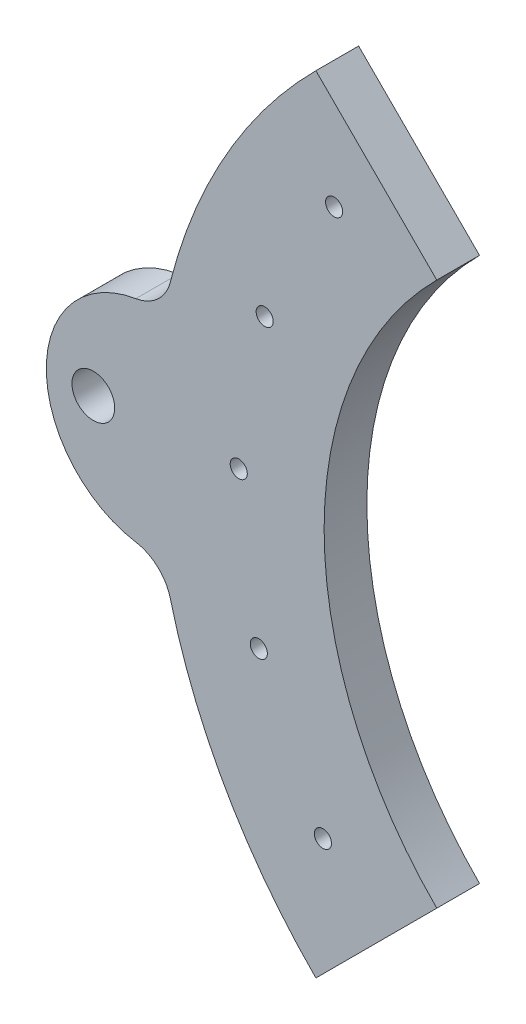
ISO-10303-21;
HEADER;
FILE_DESCRIPTION(('STEP AP214'),'2;1');
FILE_NAME('part.step','',(''),(''),'','','');
FILE_SCHEMA(('AUTOMOTIVE_DESIGN { 1 0 10303 214 1 1 1 1 }'));
ENDSEC;
DATA;
#1=APPLICATION_CONTEXT('core data for automotive mechanical design processes');
#2=APPLICATION_PROTOCOL_DEFINITION('international standard','automotive_design',2000,#1);
#3=PRODUCT_CONTEXT('',#1,'mechanical');
#4=PRODUCT('Part','Part','',(#3));
#5=PRODUCT_RELATED_PRODUCT_CATEGORY('part','',(#4));
#6=PRODUCT_DEFINITION_FORMATION('','',#4);
#7=PRODUCT_DEFINITION_CONTEXT('part definition',#1,'design');
#8=PRODUCT_DEFINITION('design','',#6,#7);
#9=PRODUCT_DEFINITION_SHAPE('','',#8);
#10=(LENGTH_UNIT() NAMED_UNIT(*) SI_UNIT(.MILLI.,.METRE.));
#11=(NAMED_UNIT(*) PLANE_ANGLE_UNIT() SI_UNIT($,.RADIAN.));
#12=(NAMED_UNIT(*) SI_UNIT($,.STERADIAN.) SOLID_ANGLE_UNIT());
#13=UNCERTAINTY_MEASURE_WITH_UNIT(LENGTH_MEASURE(1.E-05),#10,'distance_accuracy_value','');
#14=(GEOMETRIC_REPRESENTATION_CONTEXT(3) GLOBAL_UNCERTAINTY_ASSIGNED_CONTEXT((#13)) GLOBAL_UNIT_ASSIGNED_CONTEXT((#10,
#11,#12)) REPRESENTATION_CONTEXT('',''));
#15=CARTESIAN_POINT('',(0.,0.,0.));
#16=DIRECTION('',(0.,0.,1.));
#17=DIRECTION('',(1.,0.,0.));
#18=AXIS2_PLACEMENT_3D('',#15,#16,#17);
#19=CARTESIAN_POINT('',(0.,0.,10.));
#20=DIRECTION('',(0.,0.,1.));
#21=DIRECTION('',(1.,0.,0.));
#22=AXIS2_PLACEMENT_3D('',#19,#20,#21);
#23=PLANE('',#22);
#24=CARTESIAN_POINT('',(-87.6617767549108,66.4485733193135,10.));
#25=DIRECTION('',(0.,0.,1.));
#26=DIRECTION('',(1.,0.,0.));
#27=AXIS2_PLACEMENT_3D('',#24,#25,#26);
#28=CIRCLE('',#27,2.00000000000003);
#29=CARTESIAN_POINT('',(-85.6617767549107,66.4485733193135,10.));
#30=VERTEX_POINT('',#29);
#31=EDGE_CURVE('E283',#30,#30,#28,.T.);
#32=ORIENTED_EDGE('',*,*,#31,.F.);
#33=EDGE_LOOP('',(#32));
#34=FACE_BOUND('',#33,.T.);
#35=CARTESIAN_POINT('',(-103.905042420397,36.107369879476,10.));
#36=DIRECTION('',(0.,0.,1.));
#37=DIRECTION('',(1.,0.,0.));
#38=AXIS2_PLACEMENT_3D('',#35,#36,#37);
#39=CIRCLE('',#38,2.);
#40=CARTESIAN_POINT('',(-101.905042420397,36.107369879476,10.));
#41=VERTEX_POINT('',#40);
#42=EDGE_CURVE('E284',#41,#41,#39,.T.);
#43=ORIENTED_EDGE('',*,*,#42,.F.);
#44=EDGE_LOOP('',(#43));
#45=FACE_BOUND('',#44,.T.);
#46=CARTESIAN_POINT('',(-109.977358584775,2.23172550099919,10.));
#47=DIRECTION('',(0.,0.,1.));
#48=DIRECTION('',(1.,0.,0.));
#49=AXIS2_PLACEMENT_3D('',#46,#47,#48);
#50=CIRCLE('',#49,2.);
#51=CARTESIAN_POINT('',(-107.977358584775,2.23172550099919,10.));
#52=VERTEX_POINT('',#51);
#53=EDGE_CURVE('E294',#52,#52,#50,.T.);
#54=ORIENTED_EDGE('',*,*,#53,.F.);
#55=EDGE_LOOP('',(#54));
#56=FACE_BOUND('',#55,.T.);
#57=CARTESIAN_POINT('',(-105.284324633559,-31.8623757188588,10.));
#58=DIRECTION('',(0.,0.,1.));
#59=DIRECTION('',(1.,0.,0.));
#60=AXIS2_PLACEMENT_3D('',#57,#58,#59);
#61=CIRCLE('',#60,2.);
#62=CARTESIAN_POINT('',(-103.284324633559,-31.8623757188588,10.));
#63=VERTEX_POINT('',#62);
#64=EDGE_CURVE('E300',#63,#63,#61,.T.);
#65=ORIENTED_EDGE('',*,*,#64,.F.);
#66=EDGE_LOOP('',(#65));
#67=FACE_BOUND('',#66,.T.);
#68=CARTESIAN_POINT('',(-90.2853274281862,-62.8375656051274,10.));
#69=DIRECTION('',(0.,0.,1.));
#70=DIRECTION('',(1.,0.,0.));
#71=AXIS2_PLACEMENT_3D('',#68,#69,#70);
#72=CIRCLE('',#71,2.);
#73=CARTESIAN_POINT('',(-88.2853274281862,-62.8375656051274,10.));
#74=VERTEX_POINT('',#73);
#75=EDGE_CURVE('E306',#74,#74,#72,.T.);
#76=ORIENTED_EDGE('',*,*,#75,.F.);
#77=EDGE_LOOP('',(#76));
#78=FACE_BOUND('',#77,.T.);
#79=CARTESIAN_POINT('',(-130.,0.,10.));
#80=DIRECTION('',(0.,0.,1.));
#81=DIRECTION('',(1.,0.,0.));
#82=AXIS2_PLACEMENT_3D('',#79,#80,#81);
#83=CIRCLE('',#82,24.9999999999999);
#84=CARTESIAN_POINT('',(-134.052197802198,24.6694080385375,10.));
#85=VERTEX_POINT('',#84);
#86=CARTESIAN_POINT('',(-134.052197802198,-24.6694080385375,10.));
#87=VERTEX_POINT('',#86);
#88=EDGE_CURVE('E322',#85,#87,#83,.T.);
#89=ORIENTED_EDGE('',*,*,#88,.T.);
#90=CARTESIAN_POINT('',(-135.673076923077,-34.5371712539526,10.));
#91=DIRECTION('',(0.,0.,1.));
#92=DIRECTION('',(1.,0.,0.));
#93=AXIS2_PLACEMENT_3D('',#90,#91,#92);
#94=CIRCLE('',#93,10.);
#95=CARTESIAN_POINT('',(-125.982142857143,-32.0702304500988,10.));
#96=VERTEX_POINT('',#95);
#97=EDGE_CURVE('E110',#87,#96,#94,.F.);
#98=ORIENTED_EDGE('',*,*,#97,.T.);
#99=CARTESIAN_POINT('',(0.,0.,10.));
#100=DIRECTION('',(0.,0.,1.));
#101=DIRECTION('',(1.,0.,0.));
#102=AXIS2_PLACEMENT_3D('',#99,#100,#101);
#103=CIRCLE('',#102,130.);
#104=CARTESIAN_POINT('',(-91.9238815542503,-91.923881554252,10.));
#105=VERTEX_POINT('',#104);
#106=EDGE_CURVE('E103',#96,#105,#103,.T.);
#107=ORIENTED_EDGE('',*,*,#106,.T.);
#108=DIRECTION('',(0.707106781186541,0.707106781186554,0.));
#109=VECTOR('',#108,1.);
#110=CARTESIAN_POINT('',(-63.6396103067887,-63.6396103067899,10.));
#111=LINE('',#110,#109);
#112=CARTESIAN_POINT('',(-63.6396103067887,-63.6396103067898,10.));
#113=VERTEX_POINT('',#112);
#114=EDGE_CURVE('E107',#105,#113,#111,.T.);
#115=ORIENTED_EDGE('',*,*,#114,.T.);
#116=CARTESIAN_POINT('',(0.,0.,10.));
#117=DIRECTION('',(0.,0.,-1.));
#118=DIRECTION('',(1.,0.,0.));
#119=AXIS2_PLACEMENT_3D('',#116,#117,#118);
#120=CIRCLE('',#119,90.);
#121=CARTESIAN_POINT('',(-63.6396103067896,63.6396103067889,10.));
#122=VERTEX_POINT('',#121);
#123=EDGE_CURVE('E124',#113,#122,#120,.T.);
#124=ORIENTED_EDGE('',*,*,#123,.T.);
#125=DIRECTION('',(-0.707106781186551,0.707106781186544,0.));
#126=VECTOR('',#125,1.);
#127=CARTESIAN_POINT('',(-63.6396103067896,63.6396103067889,10.));
#128=LINE('',#127,#126);
#129=CARTESIAN_POINT('',(-91.9238815542517,91.9238815542507,10.));
#130=VERTEX_POINT('',#129);
#131=EDGE_CURVE('E318',#122,#130,#128,.T.);
#132=ORIENTED_EDGE('',*,*,#131,.T.);
#133=CARTESIAN_POINT('',(0.,0.,10.));
#134=DIRECTION('',(0.,0.,1.));
#135=DIRECTION('',(1.,0.,0.));
#136=AXIS2_PLACEMENT_3D('',#133,#134,#135);
#137=CIRCLE('',#136,130.);
#138=CARTESIAN_POINT('',(-125.982142857143,32.0702304500988,10.));
#139=VERTEX_POINT('',#138);
#140=EDGE_CURVE('E320',#130,#139,#137,.T.);
#141=ORIENTED_EDGE('',*,*,#140,.T.);
#142=CARTESIAN_POINT('',(-135.673076923077,34.5371712539525,10.));
#143=DIRECTION('',(0.,0.,1.));
#144=DIRECTION('',(1.,0.,0.));
#145=AXIS2_PLACEMENT_3D('',#142,#143,#144);
#146=CIRCLE('',#145,10.);
#147=EDGE_CURVE('E11',#139,#85,#146,.F.);
#148=ORIENTED_EDGE('',*,*,#147,.T.);
#149=EDGE_LOOP('',(#89,#98,#107,#115,#124,#132,#141,#148));
#150=FACE_BOUND('',#149,.T.);
#151=CARTESIAN_POINT('',(-144.,0.,10.));
#152=DIRECTION('',(0.,0.,1.));
#153=DIRECTION('',(1.,0.,0.));
#154=AXIS2_PLACEMENT_3D('',#151,#152,#153);
#155=CIRCLE('',#154,4.99999999999999);
#156=CARTESIAN_POINT('',(-139.,0.,10.));
#157=VERTEX_POINT('',#156);
#158=EDGE_CURVE('E312',#157,#157,#155,.T.);
#159=ORIENTED_EDGE('',*,*,#158,.F.);
#160=EDGE_LOOP('',(#159));
#161=FACE_BOUND('',#160,.T.);
#162=ADVANCED_FACE('F39',(#34,#45,#56,#67,#78,#150,#161),#23,.T.);
#163=CARTESIAN_POINT('',(0.,0.,0.));
#164=DIRECTION('',(0.,0.,1.));
#165=DIRECTION('',(1.,0.,0.));
#166=AXIS2_PLACEMENT_3D('',#163,#164,#165);
#167=PLANE('',#166);
#168=CARTESIAN_POINT('',(-87.6617767549108,66.4485733193135,0.));
#169=DIRECTION('',(0.,0.,1.));
#170=DIRECTION('',(1.,0.,0.));
#171=AXIS2_PLACEMENT_3D('',#168,#169,#170);
#172=CIRCLE('',#171,2.00000000000003);
#173=CARTESIAN_POINT('',(-85.6617767549107,66.4485733193135,0.));
#174=VERTEX_POINT('',#173);
#175=EDGE_CURVE('E281',#174,#174,#172,.T.);
#176=ORIENTED_EDGE('',*,*,#175,.T.);
#177=EDGE_LOOP('',(#176));
#178=FACE_BOUND('',#177,.T.);
#179=CARTESIAN_POINT('',(-103.905042420397,36.107369879476,0.));
#180=DIRECTION('',(0.,0.,1.));
#181=DIRECTION('',(1.,0.,0.));
#182=AXIS2_PLACEMENT_3D('',#179,#180,#181);
#183=CIRCLE('',#182,2.);
#184=CARTESIAN_POINT('',(-101.905042420397,36.107369879476,0.));
#185=VERTEX_POINT('',#184);
#186=EDGE_CURVE('E289',#185,#185,#183,.T.);
#187=ORIENTED_EDGE('',*,*,#186,.T.);
#188=EDGE_LOOP('',(#187));
#189=FACE_BOUND('',#188,.T.);
#190=CARTESIAN_POINT('',(-109.977358584775,2.23172550099919,0.));
#191=DIRECTION('',(0.,0.,1.));
#192=DIRECTION('',(1.,0.,0.));
#193=AXIS2_PLACEMENT_3D('',#190,#191,#192);
#194=CIRCLE('',#193,2.);
#195=CARTESIAN_POINT('',(-107.977358584775,2.23172550099919,0.));
#196=VERTEX_POINT('',#195);
#197=EDGE_CURVE('E297',#196,#196,#194,.T.);
#198=ORIENTED_EDGE('',*,*,#197,.T.);
#199=EDGE_LOOP('',(#198));
#200=FACE_BOUND('',#199,.T.);
#201=CARTESIAN_POINT('',(-105.284324633559,-31.8623757188588,0.));
#202=DIRECTION('',(0.,0.,1.));
#203=DIRECTION('',(1.,0.,0.));
#204=AXIS2_PLACEMENT_3D('',#201,#202,#203);
#205=CIRCLE('',#204,2.);
#206=CARTESIAN_POINT('',(-103.284324633559,-31.8623757188588,0.));
#207=VERTEX_POINT('',#206);
#208=EDGE_CURVE('E303',#207,#207,#205,.T.);
#209=ORIENTED_EDGE('',*,*,#208,.T.);
#210=EDGE_LOOP('',(#209));
#211=FACE_BOUND('',#210,.T.);
#212=CARTESIAN_POINT('',(-90.2853274281862,-62.8375656051274,0.));
#213=DIRECTION('',(0.,0.,1.));
#214=DIRECTION('',(1.,0.,0.));
#215=AXIS2_PLACEMENT_3D('',#212,#213,#214);
#216=CIRCLE('',#215,2.);
#217=CARTESIAN_POINT('',(-88.2853274281862,-62.8375656051274,0.));
#218=VERTEX_POINT('',#217);
#219=EDGE_CURVE('E309',#218,#218,#216,.T.);
#220=ORIENTED_EDGE('',*,*,#219,.T.);
#221=EDGE_LOOP('',(#220));
#222=FACE_BOUND('',#221,.T.);
#223=CARTESIAN_POINT('',(0.,0.,0.));
#224=DIRECTION('',(0.,0.,1.));
#225=DIRECTION('',(1.,0.,0.));
#226=AXIS2_PLACEMENT_3D('',#223,#224,#225);
#227=CIRCLE('',#226,130.);
#228=CARTESIAN_POINT('',(-125.982142857143,-32.0702304500988,0.));
#229=VERTEX_POINT('',#228);
#230=CARTESIAN_POINT('',(-91.9238815542503,-91.923881554252,0.));
#231=VERTEX_POINT('',#230);
#232=EDGE_CURVE('E128',#229,#231,#227,.T.);
#233=ORIENTED_EDGE('',*,*,#232,.F.);
#234=CARTESIAN_POINT('',(-135.673076923077,-34.5371712539526,0.));
#235=DIRECTION('',(0.,0.,1.));
#236=DIRECTION('',(1.,0.,0.));
#237=AXIS2_PLACEMENT_3D('',#234,#235,#236);
#238=CIRCLE('',#237,10.);
#239=CARTESIAN_POINT('',(-134.052197802198,-24.6694080385375,0.));
#240=VERTEX_POINT('',#239);
#241=EDGE_CURVE('E143',#229,#240,#238,.T.);
#242=ORIENTED_EDGE('',*,*,#241,.T.);
#243=CARTESIAN_POINT('',(-130.,0.,0.));
#244=DIRECTION('',(0.,0.,1.));
#245=DIRECTION('',(1.,0.,0.));
#246=AXIS2_PLACEMENT_3D('',#243,#244,#245);
#247=CIRCLE('',#246,24.9999999999999);
#248=CARTESIAN_POINT('',(-134.052197802198,24.6694080385375,0.));
#249=VERTEX_POINT('',#248);
#250=EDGE_CURVE('E115',#249,#240,#247,.T.);
#251=ORIENTED_EDGE('',*,*,#250,.F.);
#252=CARTESIAN_POINT('',(-135.673076923077,34.5371712539525,0.));
#253=DIRECTION('',(0.,0.,1.));
#254=DIRECTION('',(1.,0.,0.));
#255=AXIS2_PLACEMENT_3D('',#252,#253,#254);
#256=CIRCLE('',#255,10.);
#257=CARTESIAN_POINT('',(-125.982142857143,32.0702304500988,0.));
#258=VERTEX_POINT('',#257);
#259=EDGE_CURVE('E47',#249,#258,#256,.T.);
#260=ORIENTED_EDGE('',*,*,#259,.T.);
#261=CARTESIAN_POINT('',(0.,0.,0.));
#262=DIRECTION('',(0.,0.,1.));
#263=DIRECTION('',(1.,0.,0.));
#264=AXIS2_PLACEMENT_3D('',#261,#262,#263);
#265=CIRCLE('',#264,130.);
#266=CARTESIAN_POINT('',(-91.9238815542517,91.9238815542507,0.));
#267=VERTEX_POINT('',#266);
#268=EDGE_CURVE('E154',#267,#258,#265,.T.);
#269=ORIENTED_EDGE('',*,*,#268,.F.);
#270=DIRECTION('',(-0.707106781186551,0.707106781186544,0.));
#271=VECTOR('',#270,1.);
#272=CARTESIAN_POINT('',(-63.6396103067896,63.6396103067889,0.));
#273=LINE('',#272,#271);
#274=CARTESIAN_POINT('',(-63.6396103067896,63.6396103067889,0.));
#275=VERTEX_POINT('',#274);
#276=EDGE_CURVE('E330',#275,#267,#273,.T.);
#277=ORIENTED_EDGE('',*,*,#276,.F.);
#278=CARTESIAN_POINT('',(0.,0.,0.));
#279=DIRECTION('',(0.,0.,-1.));
#280=DIRECTION('',(1.,0.,0.));
#281=AXIS2_PLACEMENT_3D('',#278,#279,#280);
#282=CIRCLE('',#281,90.);
#283=CARTESIAN_POINT('',(-63.6396103067887,-63.6396103067898,0.));
#284=VERTEX_POINT('',#283);
#285=EDGE_CURVE('E328',#284,#275,#282,.T.);
#286=ORIENTED_EDGE('',*,*,#285,.F.);
#287=DIRECTION('',(0.707106781186541,0.707106781186554,0.));
#288=VECTOR('',#287,1.);
#289=CARTESIAN_POINT('',(-63.6396103067887,-63.6396103067899,0.));
#290=LINE('',#289,#288);
#291=EDGE_CURVE('E326',#231,#284,#290,.T.);
#292=ORIENTED_EDGE('',*,*,#291,.F.);
#293=EDGE_LOOP('',(#233,#242,#251,#260,#269,#277,#286,#292));
#294=FACE_BOUND('',#293,.T.);
#295=CARTESIAN_POINT('',(-144.,0.,0.));
#296=DIRECTION('',(0.,0.,1.));
#297=DIRECTION('',(1.,0.,0.));
#298=AXIS2_PLACEMENT_3D('',#295,#296,#297);
#299=CIRCLE('',#298,4.99999999999999);
#300=CARTESIAN_POINT('',(-139.,0.,0.));
#301=VERTEX_POINT('',#300);
#302=EDGE_CURVE('E286',#301,#301,#299,.T.);
#303=ORIENTED_EDGE('',*,*,#302,.T.);
#304=EDGE_LOOP('',(#303));
#305=FACE_BOUND('',#304,.T.);
#306=ADVANCED_FACE('F146',(#178,#189,#200,#211,#222,#294,#305),#167,.F.);
#307=CARTESIAN_POINT('',(0.,0.,10.));
#308=DIRECTION('',(0.,0.,-1.));
#309=DIRECTION('',(-1.,0.,0.));
#310=AXIS2_PLACEMENT_3D('',#307,#308,#309);
#311=CYLINDRICAL_SURFACE('',#310,130.);
#312=ORIENTED_EDGE('',*,*,#106,.F.);
#313=DIRECTION('',(0.,0.,-1.));
#314=VECTOR('',#313,1.);
#315=CARTESIAN_POINT('',(-125.982142857143,-32.0702304500988,10.));
#316=LINE('',#315,#314);
#317=EDGE_CURVE('E130',#96,#229,#316,.T.);
#318=ORIENTED_EDGE('',*,*,#317,.T.);
#319=ORIENTED_EDGE('',*,*,#232,.T.);
#320=DIRECTION('',(0.,0.,-1.));
#321=VECTOR('',#320,1.);
#322=CARTESIAN_POINT('',(-91.9238815542503,-91.923881554252,10.));
#323=LINE('',#322,#321);
#324=EDGE_CURVE('E120',#105,#231,#323,.T.);
#325=ORIENTED_EDGE('',*,*,#324,.F.);
#326=EDGE_LOOP('',(#312,#318,#319,#325));
#327=FACE_BOUND('',#326,.T.);
#328=ADVANCED_FACE('F126',(#327),#311,.T.);
#329=CARTESIAN_POINT('',(-63.6396103067887,-63.6396103067899,10.));
#330=DIRECTION('',(-0.707106781186554,0.707106781186541,0.));
#331=DIRECTION('',(-0.707106781186541,-0.707106781186554,0.));
#332=AXIS2_PLACEMENT_3D('',#329,#330,#331);
#333=PLANE('',#332);
#334=ORIENTED_EDGE('',*,*,#291,.T.);
#335=DIRECTION('',(0.,0.,-1.));
#336=VECTOR('',#335,1.);
#337=CARTESIAN_POINT('',(-63.6396103067887,-63.6396103067898,10.));
#338=LINE('',#337,#336);
#339=EDGE_CURVE('E122',#113,#284,#338,.T.);
#340=ORIENTED_EDGE('',*,*,#339,.F.);
#341=ORIENTED_EDGE('',*,*,#114,.F.);
#342=ORIENTED_EDGE('',*,*,#324,.T.);
#343=EDGE_LOOP('',(#334,#340,#341,#342));
#344=FACE_BOUND('',#343,.T.);
#345=ADVANCED_FACE('F119',(#344),#333,.F.);
#346=CARTESIAN_POINT('',(0.,0.,10.));
#347=DIRECTION('',(0.,0.,-1.));
#348=DIRECTION('',(-1.,0.,0.));
#349=AXIS2_PLACEMENT_3D('',#346,#347,#348);
#350=CYLINDRICAL_SURFACE('',#349,90.);
#351=ORIENTED_EDGE('',*,*,#285,.T.);
#352=DIRECTION('',(0.,0.,-1.));
#353=VECTOR('',#352,1.);
#354=CARTESIAN_POINT('',(-63.6396103067896,63.6396103067889,10.));
#355=LINE('',#354,#353);
#356=EDGE_CURVE('E134',#122,#275,#355,.T.);
#357=ORIENTED_EDGE('',*,*,#356,.F.);
#358=ORIENTED_EDGE('',*,*,#123,.F.);
#359=ORIENTED_EDGE('',*,*,#339,.T.);
#360=EDGE_LOOP('',(#351,#357,#358,#359));
#361=FACE_BOUND('',#360,.T.);
#362=ADVANCED_FACE('F188',(#361),#350,.F.);
#363=CARTESIAN_POINT('',(-63.6396103067896,63.6396103067889,10.));
#364=DIRECTION('',(-0.707106781186544,-0.707106781186551,0.));
#365=DIRECTION('',(0.707106781186551,-0.707106781186544,0.));
#366=AXIS2_PLACEMENT_3D('',#363,#364,#365);
#367=PLANE('',#366);
#368=ORIENTED_EDGE('',*,*,#276,.T.);
#369=DIRECTION('',(0.,0.,-1.));
#370=VECTOR('',#369,1.);
#371=CARTESIAN_POINT('',(-91.9238815542517,91.9238815542507,10.));
#372=LINE('',#371,#370);
#373=EDGE_CURVE('E324',#130,#267,#372,.T.);
#374=ORIENTED_EDGE('',*,*,#373,.F.);
#375=ORIENTED_EDGE('',*,*,#131,.F.);
#376=ORIENTED_EDGE('',*,*,#356,.T.);
#377=EDGE_LOOP('',(#368,#374,#375,#376));
#378=FACE_BOUND('',#377,.T.);
#379=ADVANCED_FACE('F185',(#378),#367,.F.);
#380=CARTESIAN_POINT('',(0.,0.,10.));
#381=DIRECTION('',(0.,0.,-1.));
#382=DIRECTION('',(-1.,0.,0.));
#383=AXIS2_PLACEMENT_3D('',#380,#381,#382);
#384=CYLINDRICAL_SURFACE('',#383,130.);
#385=ORIENTED_EDGE('',*,*,#268,.T.);
#386=DIRECTION('',(0.,0.,-1.));
#387=VECTOR('',#386,1.);
#388=CARTESIAN_POINT('',(-125.982142857143,32.0702304500988,10.));
#389=LINE('',#388,#387);
#390=EDGE_CURVE('E54',#258,#139,#389,.F.);
#391=ORIENTED_EDGE('',*,*,#390,.T.);
#392=ORIENTED_EDGE('',*,*,#140,.F.);
#393=ORIENTED_EDGE('',*,*,#373,.T.);
#394=EDGE_LOOP('',(#385,#391,#392,#393));
#395=FACE_BOUND('',#394,.T.);
#396=ADVANCED_FACE('F182',(#395),#384,.T.);
#397=CARTESIAN_POINT('',(-130.,0.,10.));
#398=DIRECTION('',(0.,0.,-1.));
#399=DIRECTION('',(-1.,0.,0.));
#400=AXIS2_PLACEMENT_3D('',#397,#398,#399);
#401=CYLINDRICAL_SURFACE('',#400,24.9999999999999);
#402=ORIENTED_EDGE('',*,*,#250,.T.);
#403=DIRECTION('',(0.,0.,-1.));
#404=VECTOR('',#403,1.);
#405=CARTESIAN_POINT('',(-134.052197802198,-24.6694080385375,10.));
#406=LINE('',#405,#404);
#407=EDGE_CURVE('E140',#240,#87,#406,.F.);
#408=ORIENTED_EDGE('',*,*,#407,.T.);
#409=ORIENTED_EDGE('',*,*,#88,.F.);
#410=DIRECTION('',(0.,0.,-1.));
#411=VECTOR('',#410,1.);
#412=CARTESIAN_POINT('',(-134.052197802198,24.6694080385375,10.));
#413=LINE('',#412,#411);
#414=EDGE_CURVE('E132',#85,#249,#413,.T.);
#415=ORIENTED_EDGE('',*,*,#414,.T.);
#416=EDGE_LOOP('',(#402,#408,#409,#415));
#417=FACE_BOUND('',#416,.T.);
#418=ADVANCED_FACE('F151',(#417),#401,.T.);
#419=CARTESIAN_POINT('',(-144.,0.,10.));
#420=DIRECTION('',(0.,0.,-1.));
#421=DIRECTION('',(-1.,0.,0.));
#422=AXIS2_PLACEMENT_3D('',#419,#420,#421);
#423=CYLINDRICAL_SURFACE('',#422,4.99999999999999);
#424=ORIENTED_EDGE('',*,*,#158,.T.);
#425=EDGE_LOOP('',(#424));
#426=FACE_BOUND('',#425,.T.);
#427=ORIENTED_EDGE('',*,*,#302,.F.);
#428=EDGE_LOOP('',(#427));
#429=FACE_BOUND('',#428,.T.);
#430=ADVANCED_FACE('F158',(#426,#429),#423,.F.);
#431=CARTESIAN_POINT('',(-135.673076923077,-34.5371712539526,10.));
#432=DIRECTION('',(0.,0.,1.));
#433=DIRECTION('',(1.,0.,0.));
#434=AXIS2_PLACEMENT_3D('',#431,#432,#433);
#435=CYLINDRICAL_SURFACE('',#434,10.);
#436=ORIENTED_EDGE('',*,*,#97,.F.);
#437=ORIENTED_EDGE('',*,*,#407,.F.);
#438=ORIENTED_EDGE('',*,*,#241,.F.);
#439=ORIENTED_EDGE('',*,*,#317,.F.);
#440=EDGE_LOOP('',(#436,#437,#438,#439));
#441=FACE_BOUND('',#440,.T.);
#442=ADVANCED_FACE('F156',(#441),#435,.F.);
#443=CARTESIAN_POINT('',(-135.673076923077,34.5371712539525,10.));
#444=DIRECTION('',(0.,0.,1.));
#445=DIRECTION('',(1.,0.,0.));
#446=AXIS2_PLACEMENT_3D('',#443,#444,#445);
#447=CYLINDRICAL_SURFACE('',#446,10.);
#448=ORIENTED_EDGE('',*,*,#147,.F.);
#449=ORIENTED_EDGE('',*,*,#390,.F.);
#450=ORIENTED_EDGE('',*,*,#259,.F.);
#451=ORIENTED_EDGE('',*,*,#414,.F.);
#452=EDGE_LOOP('',(#448,#449,#450,#451));
#453=FACE_BOUND('',#452,.T.);
#454=ADVANCED_FACE('F41',(#453),#447,.F.);
#455=CARTESIAN_POINT('',(-90.2853274281862,-62.8375656051274,0.));
#456=DIRECTION('',(0.,0.,1.));
#457=DIRECTION('',(1.,0.,0.));
#458=AXIS2_PLACEMENT_3D('',#455,#456,#457);
#459=CYLINDRICAL_SURFACE('',#458,2.);
#460=ORIENTED_EDGE('',*,*,#219,.F.);
#461=EDGE_LOOP('',(#460));
#462=FACE_BOUND('',#461,.T.);
#463=ORIENTED_EDGE('',*,*,#75,.T.);
#464=EDGE_LOOP('',(#463));
#465=FACE_BOUND('',#464,.T.);
#466=ADVANCED_FACE('F163',(#462,#465),#459,.F.);
#467=CARTESIAN_POINT('',(-105.284324633559,-31.8623757188588,0.));
#468=DIRECTION('',(0.,0.,1.));
#469=DIRECTION('',(1.,0.,0.));
#470=AXIS2_PLACEMENT_3D('',#467,#468,#469);
#471=CYLINDRICAL_SURFACE('',#470,2.);
#472=ORIENTED_EDGE('',*,*,#208,.F.);
#473=EDGE_LOOP('',(#472));
#474=FACE_BOUND('',#473,.T.);
#475=ORIENTED_EDGE('',*,*,#64,.T.);
#476=EDGE_LOOP('',(#475));
#477=FACE_BOUND('',#476,.T.);
#478=ADVANCED_FACE('F236',(#474,#477),#471,.F.);
#479=CARTESIAN_POINT('',(-109.977358584775,2.23172550099919,0.));
#480=DIRECTION('',(0.,0.,1.));
#481=DIRECTION('',(1.,0.,0.));
#482=AXIS2_PLACEMENT_3D('',#479,#480,#481);
#483=CYLINDRICAL_SURFACE('',#482,2.);
#484=ORIENTED_EDGE('',*,*,#197,.F.);
#485=EDGE_LOOP('',(#484));
#486=FACE_BOUND('',#485,.T.);
#487=ORIENTED_EDGE('',*,*,#53,.T.);
#488=EDGE_LOOP('',(#487));
#489=FACE_BOUND('',#488,.T.);
#490=ADVANCED_FACE('F245',(#486,#489),#483,.F.);
#491=CARTESIAN_POINT('',(-103.905042420397,36.107369879476,0.));
#492=DIRECTION('',(0.,0.,1.));
#493=DIRECTION('',(1.,0.,0.));
#494=AXIS2_PLACEMENT_3D('',#491,#492,#493);
#495=CYLINDRICAL_SURFACE('',#494,2.);
#496=ORIENTED_EDGE('',*,*,#186,.F.);
#497=EDGE_LOOP('',(#496));
#498=FACE_BOUND('',#497,.T.);
#499=ORIENTED_EDGE('',*,*,#42,.T.);
#500=EDGE_LOOP('',(#499));
#501=FACE_BOUND('',#500,.T.);
#502=ADVANCED_FACE('F255',(#498,#501),#495,.F.);
#503=CARTESIAN_POINT('',(-87.6617767549108,66.4485733193135,0.));
#504=DIRECTION('',(0.,0.,1.));
#505=DIRECTION('',(1.,0.,0.));
#506=AXIS2_PLACEMENT_3D('',#503,#504,#505);
#507=CYLINDRICAL_SURFACE('',#506,2.00000000000003);
#508=ORIENTED_EDGE('',*,*,#175,.F.);
#509=EDGE_LOOP('',(#508));
#510=FACE_BOUND('',#509,.T.);
#511=ORIENTED_EDGE('',*,*,#31,.T.);
#512=EDGE_LOOP('',(#511));
#513=FACE_BOUND('',#512,.T.);
#514=ADVANCED_FACE('F265',(#510,#513),#507,.F.);
#515=CLOSED_SHELL('',(#162,#306,#328,#345,#362,#379,#396,#418,#430,#442,#454,#466,#478,#490,
#502,#514));
#516=MANIFOLD_SOLID_BREP('B2',#515);
#517=ADVANCED_BREP_SHAPE_REPRESENTATION('',(#18,#516),#14);
#518=SHAPE_DEFINITION_REPRESENTATION(#9,#517);
ENDSEC;
END-ISO-10303-21;
